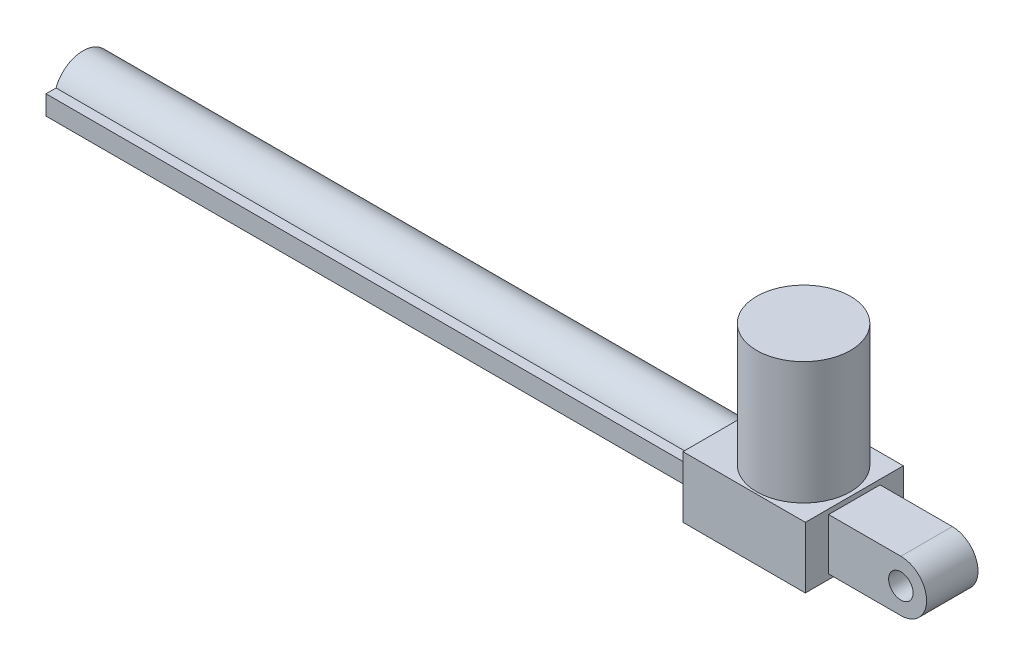
ISO-10303-21;
HEADER;
FILE_DESCRIPTION(('STEP AP214'),'2;1');
FILE_NAME('part.step','',(''),(''),'','','');
FILE_SCHEMA(('AUTOMOTIVE_DESIGN { 1 0 10303 214 1 1 1 1 }'));
ENDSEC;
DATA;
#1=APPLICATION_CONTEXT('core data for automotive mechanical design processes');
#2=APPLICATION_PROTOCOL_DEFINITION('international standard','automotive_design',2000,#1);
#3=PRODUCT_CONTEXT('',#1,'mechanical');
#4=PRODUCT('Part','Part','',(#3));
#5=PRODUCT_RELATED_PRODUCT_CATEGORY('part','',(#4));
#6=PRODUCT_DEFINITION_FORMATION('','',#4);
#7=PRODUCT_DEFINITION_CONTEXT('part definition',#1,'design');
#8=PRODUCT_DEFINITION('design','',#6,#7);
#9=PRODUCT_DEFINITION_SHAPE('','',#8);
#10=(LENGTH_UNIT() NAMED_UNIT(*) SI_UNIT(.MILLI.,.METRE.));
#11=(NAMED_UNIT(*) PLANE_ANGLE_UNIT() SI_UNIT($,.RADIAN.));
#12=(NAMED_UNIT(*) SI_UNIT($,.STERADIAN.) SOLID_ANGLE_UNIT());
#13=UNCERTAINTY_MEASURE_WITH_UNIT(LENGTH_MEASURE(1.E-05),#10,'distance_accuracy_value','');
#14=(GEOMETRIC_REPRESENTATION_CONTEXT(3) GLOBAL_UNCERTAINTY_ASSIGNED_CONTEXT((#13)) GLOBAL_UNIT_ASSIGNED_CONTEXT((#10,
#11,#12)) REPRESENTATION_CONTEXT('',''));
#15=CARTESIAN_POINT('',(0.,0.,0.));
#16=DIRECTION('',(0.,0.,1.));
#17=DIRECTION('',(1.,0.,0.));
#18=AXIS2_PLACEMENT_3D('',#15,#16,#17);
#19=CARTESIAN_POINT('',(-24.0350877192983,0.,6.81578947368422));
#20=DIRECTION('',(0.,0.,-1.));
#21=DIRECTION('',(0.,1.,0.));
#22=AXIS2_PLACEMENT_3D('',#19,#20,#21);
#23=PLANE('',#22);
#24=DIRECTION('',(-1.,0.,0.));
#25=VECTOR('',#24,1.);
#26=CARTESIAN_POINT('',(-24.0350877192983,2.,6.81578947368422));
#27=LINE('',#26,#25);
#28=CARTESIAN_POINT('',(-34.5350877192983,2.,6.81578947368422));
#29=VERTEX_POINT('',#28);
#30=CARTESIAN_POINT('',(-64.0350877192983,2.,6.81578947368422));
#31=VERTEX_POINT('',#30);
#32=EDGE_CURVE('E235',#29,#31,#27,.T.);
#33=ORIENTED_EDGE('',*,*,#32,.F.);
#34=CARTESIAN_POINT('',(-34.5350877192983,12.5,6.81578947368422));
#35=DIRECTION('',(0.,0.,-1.));
#36=DIRECTION('',(0.,1.,0.));
#37=AXIS2_PLACEMENT_3D('',#34,#35,#36);
#38=CIRCLE('',#37,10.5);
#39=CARTESIAN_POINT('',(-34.5350877192983,23.,6.81578947368422));
#40=VERTEX_POINT('',#39);
#41=EDGE_CURVE('E222',#29,#40,#38,.F.);
#42=ORIENTED_EDGE('',*,*,#41,.T.);
#43=DIRECTION('',(-1.,0.,0.));
#44=VECTOR('',#43,1.);
#45=CARTESIAN_POINT('',(-24.0350877192983,23.,6.81578947368422));
#46=LINE('',#45,#44);
#47=CARTESIAN_POINT('',(-64.0350877192983,23.,6.81578947368422));
#48=VERTEX_POINT('',#47);
#49=EDGE_CURVE('E145',#40,#48,#46,.T.);
#50=ORIENTED_EDGE('',*,*,#49,.T.);
#51=DIRECTION('',(0.,-1.,0.));
#52=VECTOR('',#51,1.);
#53=CARTESIAN_POINT('',(-64.0350877192983,0.,6.81578947368422));
#54=LINE('',#53,#52);
#55=EDGE_CURVE('E229',#48,#31,#54,.T.);
#56=ORIENTED_EDGE('',*,*,#55,.T.);
#57=EDGE_LOOP('',(#33,#42,#50,#56));
#58=FACE_BOUND('',#57,.T.);
#59=CARTESIAN_POINT('',(-34.5350877192983,12.5,6.81578947368422));
#60=DIRECTION('',(0.,0.,-1.));
#61=DIRECTION('',(0.,1.,0.));
#62=AXIS2_PLACEMENT_3D('',#59,#60,#61);
#63=CIRCLE('',#62,5.);
#64=CARTESIAN_POINT('',(-34.5350877192983,17.5,6.81578947368422));
#65=VERTEX_POINT('',#64);
#66=EDGE_CURVE('E238',#65,#65,#63,.F.);
#67=ORIENTED_EDGE('',*,*,#66,.F.);
#68=EDGE_LOOP('',(#67));
#69=FACE_BOUND('',#68,.T.);
#70=ADVANCED_FACE('F128',(#58,#69),#23,.F.);
#71=CARTESIAN_POINT('',(-24.0350877192983,0.,-14.1842105263158));
#72=DIRECTION('',(0.,0.,-1.));
#73=DIRECTION('',(0.,1.,0.));
#74=AXIS2_PLACEMENT_3D('',#71,#72,#73);
#75=PLANE('',#74);
#76=CARTESIAN_POINT('',(-34.5350877192983,12.5,-14.1842105263158));
#77=DIRECTION('',(0.,0.,-1.));
#78=DIRECTION('',(0.,1.,0.));
#79=AXIS2_PLACEMENT_3D('',#76,#77,#78);
#80=CIRCLE('',#79,5.);
#81=CARTESIAN_POINT('',(-34.5350877192983,17.5,-14.1842105263158));
#82=VERTEX_POINT('',#81);
#83=EDGE_CURVE('E132',#82,#82,#80,.F.);
#84=ORIENTED_EDGE('',*,*,#83,.T.);
#85=EDGE_LOOP('',(#84));
#86=FACE_BOUND('',#85,.T.);
#87=CARTESIAN_POINT('',(-34.5350877192983,12.5,-14.1842105263158));
#88=DIRECTION('',(0.,0.,-1.));
#89=DIRECTION('',(0.,1.,0.));
#90=AXIS2_PLACEMENT_3D('',#87,#88,#89);
#91=CIRCLE('',#90,10.5);
#92=CARTESIAN_POINT('',(-34.5350877192983,2.,-14.1842105263158));
#93=VERTEX_POINT('',#92);
#94=CARTESIAN_POINT('',(-34.5350877192983,23.,-14.1842105263158));
#95=VERTEX_POINT('',#94);
#96=EDGE_CURVE('E230',#93,#95,#91,.F.);
#97=ORIENTED_EDGE('',*,*,#96,.F.);
#98=DIRECTION('',(-1.,0.,0.));
#99=VECTOR('',#98,1.);
#100=CARTESIAN_POINT('',(-24.0350877192983,2.,-14.1842105263158));
#101=LINE('',#100,#99);
#102=CARTESIAN_POINT('',(-64.0350877192983,2.,-14.1842105263158));
#103=VERTEX_POINT('',#102);
#104=EDGE_CURVE('E237',#93,#103,#101,.T.);
#105=ORIENTED_EDGE('',*,*,#104,.T.);
#106=DIRECTION('',(0.,-1.,0.));
#107=VECTOR('',#106,1.);
#108=CARTESIAN_POINT('',(-64.0350877192983,0.,-14.1842105263158));
#109=LINE('',#108,#107);
#110=CARTESIAN_POINT('',(-64.0350877192983,23.,-14.1842105263158));
#111=VERTEX_POINT('',#110);
#112=EDGE_CURVE('E527',#111,#103,#109,.T.);
#113=ORIENTED_EDGE('',*,*,#112,.F.);
#114=DIRECTION('',(-1.,0.,0.));
#115=VECTOR('',#114,1.);
#116=CARTESIAN_POINT('',(-24.0350877192983,23.,-14.1842105263158));
#117=LINE('',#116,#115);
#118=EDGE_CURVE('E153',#95,#111,#117,.T.);
#119=ORIENTED_EDGE('',*,*,#118,.F.);
#120=EDGE_LOOP('',(#97,#105,#113,#119));
#121=FACE_BOUND('',#120,.T.);
#122=ADVANCED_FACE('F351',(#86,#121),#75,.T.);
#123=CARTESIAN_POINT('',(-64.0350877192983,25.,-23.6842105263158));
#124=DIRECTION('',(-1.,0.,0.));
#125=DIRECTION('',(0.,0.,1.));
#126=AXIS2_PLACEMENT_3D('',#123,#124,#125);
#127=PLANE('',#126);
#128=DIRECTION('',(0.,0.,-1.));
#129=VECTOR('',#128,1.);
#130=CARTESIAN_POINT('',(-64.0350877192983,0.,-23.6842105263158));
#131=LINE('',#130,#129);
#132=CARTESIAN_POINT('',(-64.0350877192983,0.,16.3157894736842));
#133=VERTEX_POINT('',#132);
#134=CARTESIAN_POINT('',(-64.0350877192983,0.,-23.6842105263158));
#135=VERTEX_POINT('',#134);
#136=EDGE_CURVE('E302',#133,#135,#131,.T.);
#137=ORIENTED_EDGE('',*,*,#136,.T.);
#138=DIRECTION('',(0.,-1.,0.));
#139=VECTOR('',#138,1.);
#140=CARTESIAN_POINT('',(-64.0350877192983,25.,-23.6842105263158));
#141=LINE('',#140,#139);
#142=CARTESIAN_POINT('',(-64.0350877192983,25.,-23.6842105263158));
#143=VERTEX_POINT('',#142);
#144=EDGE_CURVE('E307',#143,#135,#141,.T.);
#145=ORIENTED_EDGE('',*,*,#144,.F.);
#146=DIRECTION('',(0.,0.,-1.));
#147=VECTOR('',#146,1.);
#148=CARTESIAN_POINT('',(-64.0350877192983,25.,-23.6842105263158));
#149=LINE('',#148,#147);
#150=CARTESIAN_POINT('',(-64.0350877192983,25.,16.3157894736842));
#151=VERTEX_POINT('',#150);
#152=EDGE_CURVE('E293',#151,#143,#149,.T.);
#153=ORIENTED_EDGE('',*,*,#152,.F.);
#154=DIRECTION('',(0.,-1.,0.));
#155=VECTOR('',#154,1.);
#156=CARTESIAN_POINT('',(-64.0350877192983,25.,16.3157894736842));
#157=LINE('',#156,#155);
#158=EDGE_CURVE('E310',#151,#133,#157,.T.);
#159=ORIENTED_EDGE('',*,*,#158,.T.);
#160=EDGE_LOOP('',(#137,#145,#153,#159));
#161=FACE_BOUND('',#160,.T.);
#162=ORIENTED_EDGE('',*,*,#55,.F.);
#163=DIRECTION('',(0.,0.,-1.));
#164=VECTOR('',#163,1.);
#165=CARTESIAN_POINT('',(-64.0350877192983,23.,0.));
#166=LINE('',#165,#164);
#167=EDGE_CURVE('E530',#48,#111,#166,.T.);
#168=ORIENTED_EDGE('',*,*,#167,.T.);
#169=ORIENTED_EDGE('',*,*,#112,.T.);
#170=DIRECTION('',(0.,0.,-1.));
#171=VECTOR('',#170,1.);
#172=CARTESIAN_POINT('',(-64.0350877192983,2.,0.));
#173=LINE('',#172,#171);
#174=EDGE_CURVE('E525',#31,#103,#173,.T.);
#175=ORIENTED_EDGE('',*,*,#174,.F.);
#176=EDGE_LOOP('',(#162,#168,#169,#175));
#177=FACE_BOUND('',#176,.T.);
#178=ADVANCED_FACE('F329',(#161,#177),#127,.F.);
#179=CARTESIAN_POINT('',(-114.035087719298,25.,-23.6842105263158));
#180=DIRECTION('',(1.,0.,0.));
#181=DIRECTION('',(0.,0.,-1.));
#182=AXIS2_PLACEMENT_3D('',#179,#180,#181);
#183=PLANE('',#182);
#184=DIRECTION('',(0.,0.,1.));
#185=VECTOR('',#184,1.);
#186=CARTESIAN_POINT('',(-114.035087719298,0.,-23.6842105263158));
#187=LINE('',#186,#185);
#188=CARTESIAN_POINT('',(-114.035087719298,0.,-23.6842105263158));
#189=VERTEX_POINT('',#188);
#190=CARTESIAN_POINT('',(-114.035087719298,0.,16.3157894736842));
#191=VERTEX_POINT('',#190);
#192=EDGE_CURVE('E285',#189,#191,#187,.T.);
#193=ORIENTED_EDGE('',*,*,#192,.T.);
#194=DIRECTION('',(0.,-1.,0.));
#195=VECTOR('',#194,1.);
#196=CARTESIAN_POINT('',(-114.035087719298,25.,16.3157894736842));
#197=LINE('',#196,#195);
#198=CARTESIAN_POINT('',(-114.035087719298,25.,16.3157894736842));
#199=VERTEX_POINT('',#198);
#200=EDGE_CURVE('E137',#199,#191,#197,.T.);
#201=ORIENTED_EDGE('',*,*,#200,.F.);
#202=DIRECTION('',(0.,0.,1.));
#203=VECTOR('',#202,1.);
#204=CARTESIAN_POINT('',(-114.035087719298,25.,-23.6842105263158));
#205=LINE('',#204,#203);
#206=CARTESIAN_POINT('',(-114.035087719298,25.,-23.6842105263158));
#207=VERTEX_POINT('',#206);
#208=EDGE_CURVE('E287',#207,#199,#205,.T.);
#209=ORIENTED_EDGE('',*,*,#208,.F.);
#210=DIRECTION('',(0.,-1.,0.));
#211=VECTOR('',#210,1.);
#212=CARTESIAN_POINT('',(-114.035087719298,25.,-23.6842105263158));
#213=LINE('',#212,#211);
#214=EDGE_CURVE('E297',#207,#189,#213,.T.);
#215=ORIENTED_EDGE('',*,*,#214,.T.);
#216=EDGE_LOOP('',(#193,#201,#209,#215));
#217=FACE_BOUND('',#216,.T.);
#218=CARTESIAN_POINT('',(-114.035087719298,12.5,-3.68421052631578));
#219=DIRECTION('',(-1.,0.,0.));
#220=DIRECTION('',(0.,0.,1.));
#221=AXIS2_PLACEMENT_3D('',#218,#219,#220);
#222=CIRCLE('',#221,11.7863583196308);
#223=CARTESIAN_POINT('',(-114.035087719298,16.643229465341,7.34991345505487));
#224=VERTEX_POINT('',#223);
#225=CARTESIAN_POINT('',(-114.035087719298,8.73562524043602,7.48484158692493));
#226=VERTEX_POINT('',#225);
#227=EDGE_CURVE('E244',#224,#226,#222,.T.);
#228=ORIENTED_EDGE('',*,*,#227,.F.);
#229=DIRECTION('',(0.,0.,1.));
#230=VECTOR('',#229,1.);
#231=CARTESIAN_POINT('',(-114.035087719298,16.643229465341,0.));
#232=LINE('',#231,#230);
#233=CARTESIAN_POINT('',(-114.035087719298,16.643229465341,11.4452547961822));
#234=VERTEX_POINT('',#233);
#235=EDGE_CURVE('E253',#224,#234,#232,.T.);
#236=ORIENTED_EDGE('',*,*,#235,.T.);
#237=DIRECTION('',(0.,-1.,0.));
#238=VECTOR('',#237,1.);
#239=CARTESIAN_POINT('',(-114.035087719298,0.,11.4452547961821));
#240=LINE('',#239,#238);
#241=CARTESIAN_POINT('',(-114.035087719298,8.73562524043602,11.4452547961821));
#242=VERTEX_POINT('',#241);
#243=EDGE_CURVE('E270',#234,#242,#240,.T.);
#244=ORIENTED_EDGE('',*,*,#243,.T.);
#245=DIRECTION('',(0.,0.,1.));
#246=VECTOR('',#245,1.);
#247=CARTESIAN_POINT('',(-114.035087719298,8.73562524043602,0.));
#248=LINE('',#247,#246);
#249=EDGE_CURVE('E267',#226,#242,#248,.T.);
#250=ORIENTED_EDGE('',*,*,#249,.F.);
#251=EDGE_LOOP('',(#228,#236,#244,#250));
#252=FACE_BOUND('',#251,.T.);
#253=ADVANCED_FACE('F320',(#217,#252),#183,.F.);
#254=CARTESIAN_POINT('',(-114.035087719298,25.,16.3157894736842));
#255=DIRECTION('',(0.,0.,-1.));
#256=DIRECTION('',(-1.,0.,0.));
#257=AXIS2_PLACEMENT_3D('',#254,#255,#256);
#258=PLANE('',#257);
#259=DIRECTION('',(1.,0.,0.));
#260=VECTOR('',#259,1.);
#261=CARTESIAN_POINT('',(-114.035087719298,0.,16.3157894736842));
#262=LINE('',#261,#260);
#263=EDGE_CURVE('E300',#191,#133,#262,.T.);
#264=ORIENTED_EDGE('',*,*,#263,.T.);
#265=ORIENTED_EDGE('',*,*,#158,.F.);
#266=DIRECTION('',(1.,0.,0.));
#267=VECTOR('',#266,1.);
#268=CARTESIAN_POINT('',(-114.035087719298,25.,16.3157894736842));
#269=LINE('',#268,#267);
#270=EDGE_CURVE('E290',#199,#151,#269,.T.);
#271=ORIENTED_EDGE('',*,*,#270,.F.);
#272=ORIENTED_EDGE('',*,*,#200,.T.);
#273=EDGE_LOOP('',(#264,#265,#271,#272));
#274=FACE_BOUND('',#273,.T.);
#275=ADVANCED_FACE('F315',(#274),#258,.F.);
#276=CARTESIAN_POINT('',(-114.035087719298,25.,-23.6842105263158));
#277=DIRECTION('',(0.,0.,1.));
#278=DIRECTION('',(1.,0.,0.));
#279=AXIS2_PLACEMENT_3D('',#276,#277,#278);
#280=PLANE('',#279);
#281=DIRECTION('',(-1.,0.,0.));
#282=VECTOR('',#281,1.);
#283=CARTESIAN_POINT('',(-114.035087719298,0.,-23.6842105263158));
#284=LINE('',#283,#282);
#285=EDGE_CURVE('E291',#135,#189,#284,.T.);
#286=ORIENTED_EDGE('',*,*,#285,.T.);
#287=ORIENTED_EDGE('',*,*,#214,.F.);
#288=DIRECTION('',(-1.,0.,0.));
#289=VECTOR('',#288,1.);
#290=CARTESIAN_POINT('',(-114.035087719298,25.,-23.6842105263158));
#291=LINE('',#290,#289);
#292=EDGE_CURVE('E295',#143,#207,#291,.T.);
#293=ORIENTED_EDGE('',*,*,#292,.F.);
#294=ORIENTED_EDGE('',*,*,#144,.T.);
#295=EDGE_LOOP('',(#286,#287,#293,#294));
#296=FACE_BOUND('',#295,.T.);
#297=ADVANCED_FACE('F334',(#296),#280,.F.);
#298=CARTESIAN_POINT('',(0.,25.,0.));
#299=DIRECTION('',(0.,1.,0.));
#300=DIRECTION('',(0.,0.,1.));
#301=AXIS2_PLACEMENT_3D('',#298,#299,#300);
#302=PLANE('',#301);
#303=CARTESIAN_POINT('',(-84.7705318729496,25.,-3.68421052631579));
#304=DIRECTION('',(0.,1.,0.));
#305=DIRECTION('',(0.,0.,1.));
#306=AXIS2_PLACEMENT_3D('',#303,#304,#305);
#307=CIRCLE('',#306,19.1585508477146);
#308=CARTESIAN_POINT('',(-84.7705318729496,25.,15.4743403213988));
#309=VERTEX_POINT('',#308);
#310=EDGE_CURVE('E12',#309,#309,#307,.T.);
#311=ORIENTED_EDGE('',*,*,#310,.F.);
#312=EDGE_LOOP('',(#311));
#313=FACE_BOUND('',#312,.T.);
#314=ORIENTED_EDGE('',*,*,#208,.T.);
#315=ORIENTED_EDGE('',*,*,#270,.T.);
#316=ORIENTED_EDGE('',*,*,#152,.T.);
#317=ORIENTED_EDGE('',*,*,#292,.T.);
#318=EDGE_LOOP('',(#314,#315,#316,#317));
#319=FACE_BOUND('',#318,.T.);
#320=ADVANCED_FACE('F336',(#313,#319),#302,.T.);
#321=CARTESIAN_POINT('',(0.,0.,0.));
#322=DIRECTION('',(0.,1.,0.));
#323=DIRECTION('',(0.,0.,1.));
#324=AXIS2_PLACEMENT_3D('',#321,#322,#323);
#325=PLANE('',#324);
#326=ORIENTED_EDGE('',*,*,#192,.F.);
#327=ORIENTED_EDGE('',*,*,#285,.F.);
#328=ORIENTED_EDGE('',*,*,#136,.F.);
#329=ORIENTED_EDGE('',*,*,#263,.F.);
#330=EDGE_LOOP('',(#326,#327,#328,#329));
#331=FACE_BOUND('',#330,.T.);
#332=ADVANCED_FACE('F325',(#331),#325,.F.);
#333=CARTESIAN_POINT('',(-84.7705318729496,75.,-3.68421052631579));
#334=DIRECTION('',(0.,-1.,0.));
#335=DIRECTION('',(0.,0.,-1.));
#336=AXIS2_PLACEMENT_3D('',#333,#334,#335);
#337=CYLINDRICAL_SURFACE('',#336,19.1585508477146);
#338=CARTESIAN_POINT('',(-84.7705318729496,75.,-3.68421052631579));
#339=DIRECTION('',(0.,1.,0.));
#340=DIRECTION('',(0.,0.,1.));
#341=AXIS2_PLACEMENT_3D('',#338,#339,#340);
#342=CIRCLE('',#341,19.1585508477146);
#343=CARTESIAN_POINT('',(-84.7705318729496,75.,15.4743403213988));
#344=VERTEX_POINT('',#343);
#345=EDGE_CURVE('E283',#344,#344,#342,.T.);
#346=ORIENTED_EDGE('',*,*,#345,.F.);
#347=EDGE_LOOP('',(#346));
#348=FACE_BOUND('',#347,.T.);
#349=ORIENTED_EDGE('',*,*,#310,.T.);
#350=EDGE_LOOP('',(#349));
#351=FACE_BOUND('',#350,.T.);
#352=ADVANCED_FACE('F344',(#348,#351),#337,.T.);
#353=CARTESIAN_POINT('',(0.,75.,0.));
#354=DIRECTION('',(0.,1.,0.));
#355=DIRECTION('',(0.,0.,1.));
#356=AXIS2_PLACEMENT_3D('',#353,#354,#355);
#357=PLANE('',#356);
#358=ORIENTED_EDGE('',*,*,#345,.T.);
#359=EDGE_LOOP('',(#358));
#360=FACE_BOUND('',#359,.T.);
#361=ADVANCED_FACE('F381',(#360),#357,.T.);
#362=CARTESIAN_POINT('',(-379.035087719298,12.5,-3.68421052631569));
#363=DIRECTION('',(1.,0.,0.));
#364=DIRECTION('',(0.,0.,-1.));
#365=AXIS2_PLACEMENT_3D('',#362,#363,#364);
#366=CYLINDRICAL_SURFACE('',#365,11.7863583196308);
#367=ORIENTED_EDGE('',*,*,#227,.T.);
#368=DIRECTION('',(1.,0.,0.));
#369=VECTOR('',#368,1.);
#370=CARTESIAN_POINT('',(-379.035087719298,8.73562524043602,7.48484158692502));
#371=LINE('',#370,#369);
#372=CARTESIAN_POINT('',(-379.035087719298,8.73562524043602,7.48484158692502));
#373=VERTEX_POINT('',#372);
#374=EDGE_CURVE('E281',#373,#226,#371,.T.);
#375=ORIENTED_EDGE('',*,*,#374,.F.);
#376=CARTESIAN_POINT('',(-379.035087719298,12.5,-3.68421052631569));
#377=DIRECTION('',(-1.,0.,0.));
#378=DIRECTION('',(0.,0.,1.));
#379=AXIS2_PLACEMENT_3D('',#376,#377,#378);
#380=CIRCLE('',#379,11.7863583196308);
#381=CARTESIAN_POINT('',(-379.035087719298,16.643229465341,7.34991345505496));
#382=VERTEX_POINT('',#381);
#383=EDGE_CURVE('E252',#382,#373,#380,.T.);
#384=ORIENTED_EDGE('',*,*,#383,.F.);
#385=DIRECTION('',(1.,0.,0.));
#386=VECTOR('',#385,1.);
#387=CARTESIAN_POINT('',(-379.035087719298,16.643229465341,7.34991345505496));
#388=LINE('',#387,#386);
#389=EDGE_CURVE('E263',#382,#224,#388,.T.);
#390=ORIENTED_EDGE('',*,*,#389,.T.);
#391=EDGE_LOOP('',(#367,#375,#384,#390));
#392=FACE_BOUND('',#391,.T.);
#393=ADVANCED_FACE('F377',(#392),#366,.T.);
#394=CARTESIAN_POINT('',(-379.035087719298,8.73562524043602,1.34908356391357E-13));
#395=DIRECTION('',(0.,1.,0.));
#396=DIRECTION('',(0.,0.,1.));
#397=AXIS2_PLACEMENT_3D('',#394,#395,#396);
#398=PLANE('',#397);
#399=ORIENTED_EDGE('',*,*,#249,.T.);
#400=DIRECTION('',(1.,0.,0.));
#401=VECTOR('',#400,1.);
#402=CARTESIAN_POINT('',(-379.035087719298,8.73562524043602,11.4452547961822));
#403=LINE('',#402,#401);
#404=CARTESIAN_POINT('',(-379.035087719298,8.73562524043602,11.4452547961822));
#405=VERTEX_POINT('',#404);
#406=EDGE_CURVE('E279',#405,#242,#403,.T.);
#407=ORIENTED_EDGE('',*,*,#406,.F.);
#408=DIRECTION('',(0.,0.,1.));
#409=VECTOR('',#408,1.);
#410=CARTESIAN_POINT('',(-379.035087719298,8.73562524043602,1.34908356391357E-13));
#411=LINE('',#410,#409);
#412=EDGE_CURVE('E256',#373,#405,#411,.T.);
#413=ORIENTED_EDGE('',*,*,#412,.F.);
#414=ORIENTED_EDGE('',*,*,#374,.T.);
#415=EDGE_LOOP('',(#399,#407,#413,#414));
#416=FACE_BOUND('',#415,.T.);
#417=ADVANCED_FACE('F373',(#416),#398,.F.);
#418=CARTESIAN_POINT('',(-379.035087719298,0.,11.4452547961822));
#419=DIRECTION('',(0.,0.,1.));
#420=DIRECTION('',(1.,0.,0.));
#421=AXIS2_PLACEMENT_3D('',#418,#419,#420);
#422=PLANE('',#421);
#423=ORIENTED_EDGE('',*,*,#243,.F.);
#424=DIRECTION('',(1.,0.,0.));
#425=VECTOR('',#424,1.);
#426=CARTESIAN_POINT('',(-379.035087719298,16.643229465341,11.4452547961822));
#427=LINE('',#426,#425);
#428=CARTESIAN_POINT('',(-379.035087719298,16.643229465341,11.4452547961822));
#429=VERTEX_POINT('',#428);
#430=EDGE_CURVE('E276',#429,#234,#427,.T.);
#431=ORIENTED_EDGE('',*,*,#430,.F.);
#432=DIRECTION('',(0.,-1.,0.));
#433=VECTOR('',#432,1.);
#434=CARTESIAN_POINT('',(-379.035087719298,0.,11.4452547961822));
#435=LINE('',#434,#433);
#436=EDGE_CURVE('E258',#429,#405,#435,.T.);
#437=ORIENTED_EDGE('',*,*,#436,.T.);
#438=ORIENTED_EDGE('',*,*,#406,.T.);
#439=EDGE_LOOP('',(#423,#431,#437,#438));
#440=FACE_BOUND('',#439,.T.);
#441=ADVANCED_FACE('F370',(#440),#422,.T.);
#442=CARTESIAN_POINT('',(-379.035087719298,12.5,-3.68421052631569));
#443=DIRECTION('',(1.,0.,0.));
#444=DIRECTION('',(0.,0.,-1.));
#445=AXIS2_PLACEMENT_3D('',#442,#443,#444);
#446=CYLINDRICAL_SURFACE('',#445,9.51427354791665);
#447=CARTESIAN_POINT('',(-379.035087719298,12.5,-3.68421052631569));
#448=DIRECTION('',(-1.,0.,0.));
#449=DIRECTION('',(0.,0.,1.));
#450=AXIS2_PLACEMENT_3D('',#447,#448,#449);
#451=CIRCLE('',#450,9.51427354791665);
#452=CARTESIAN_POINT('',(-379.035087719298,12.5,5.83006302160096));
#453=VERTEX_POINT('',#452);
#454=EDGE_CURVE('E249',#453,#453,#451,.T.);
#455=ORIENTED_EDGE('',*,*,#454,.T.);
#456=EDGE_LOOP('',(#455));
#457=FACE_BOUND('',#456,.T.);
#458=CARTESIAN_POINT('',(-114.035087719298,12.5,-3.68421052631578));
#459=DIRECTION('',(-1.,0.,0.));
#460=DIRECTION('',(0.,0.,1.));
#461=AXIS2_PLACEMENT_3D('',#458,#459,#460);
#462=CIRCLE('',#461,9.51427354791665);
#463=CARTESIAN_POINT('',(-114.035087719298,12.5,5.83006302160086));
#464=VERTEX_POINT('',#463);
#465=EDGE_CURVE('E241',#464,#464,#462,.T.);
#466=ORIENTED_EDGE('',*,*,#465,.F.);
#467=EDGE_LOOP('',(#466));
#468=FACE_BOUND('',#467,.T.);
#469=ADVANCED_FACE('F368',(#457,#468),#446,.F.);
#470=CARTESIAN_POINT('',(-379.035087719298,16.643229465341,1.34908356391357E-13));
#471=DIRECTION('',(0.,1.,0.));
#472=DIRECTION('',(0.,0.,1.));
#473=AXIS2_PLACEMENT_3D('',#470,#471,#472);
#474=PLANE('',#473);
#475=ORIENTED_EDGE('',*,*,#235,.F.);
#476=ORIENTED_EDGE('',*,*,#389,.F.);
#477=DIRECTION('',(0.,0.,1.));
#478=VECTOR('',#477,1.);
#479=CARTESIAN_POINT('',(-379.035087719298,16.643229465341,1.34908356391357E-13));
#480=LINE('',#479,#478);
#481=EDGE_CURVE('E261',#382,#429,#480,.T.);
#482=ORIENTED_EDGE('',*,*,#481,.T.);
#483=ORIENTED_EDGE('',*,*,#430,.T.);
#484=EDGE_LOOP('',(#475,#476,#482,#483));
#485=FACE_BOUND('',#484,.T.);
#486=ADVANCED_FACE('F364',(#485),#474,.T.);
#487=CARTESIAN_POINT('',(-379.035087719298,0.,1.34908356391357E-13));
#488=DIRECTION('',(-1.,0.,0.));
#489=DIRECTION('',(0.,0.,1.));
#490=AXIS2_PLACEMENT_3D('',#487,#488,#489);
#491=PLANE('',#490);
#492=ORIENTED_EDGE('',*,*,#454,.F.);
#493=EDGE_LOOP('',(#492));
#494=FACE_BOUND('',#493,.T.);
#495=ORIENTED_EDGE('',*,*,#383,.T.);
#496=ORIENTED_EDGE('',*,*,#412,.T.);
#497=ORIENTED_EDGE('',*,*,#436,.F.);
#498=ORIENTED_EDGE('',*,*,#481,.F.);
#499=EDGE_LOOP('',(#495,#496,#497,#498));
#500=FACE_BOUND('',#499,.T.);
#501=ADVANCED_FACE('F361',(#494,#500),#491,.T.);
#502=ORIENTED_EDGE('',*,*,#465,.T.);
#503=EDGE_LOOP('',(#502));
#504=FACE_BOUND('',#503,.T.);
#505=ADVANCED_FACE('F130',(#504),#183,.F.);
#506=CARTESIAN_POINT('',(-24.0350877192983,2.,0.));
#507=DIRECTION('',(0.,1.,0.));
#508=DIRECTION('',(0.,0.,1.));
#509=AXIS2_PLACEMENT_3D('',#506,#507,#508);
#510=PLANE('',#509);
#511=ORIENTED_EDGE('',*,*,#104,.F.);
#512=DIRECTION('',(0.,0.,1.));
#513=VECTOR('',#512,1.);
#514=CARTESIAN_POINT('',(-34.5350877192983,2.,-18.1842105263158));
#515=LINE('',#514,#513);
#516=EDGE_CURVE('E225',#93,#29,#515,.T.);
#517=ORIENTED_EDGE('',*,*,#516,.T.);
#518=ORIENTED_EDGE('',*,*,#32,.T.);
#519=ORIENTED_EDGE('',*,*,#174,.T.);
#520=EDGE_LOOP('',(#511,#517,#518,#519));
#521=FACE_BOUND('',#520,.T.);
#522=ADVANCED_FACE('F233',(#521),#510,.F.);
#523=CARTESIAN_POINT('',(-24.0350877192983,23.,0.));
#524=DIRECTION('',(0.,1.,0.));
#525=DIRECTION('',(0.,0.,1.));
#526=AXIS2_PLACEMENT_3D('',#523,#524,#525);
#527=PLANE('',#526);
#528=DIRECTION('',(0.,0.,-1.));
#529=VECTOR('',#528,1.);
#530=CARTESIAN_POINT('',(-34.5350877192983,23.,16.3157894736842));
#531=LINE('',#530,#529);
#532=EDGE_CURVE('E227',#40,#95,#531,.T.);
#533=ORIENTED_EDGE('',*,*,#532,.T.);
#534=ORIENTED_EDGE('',*,*,#118,.T.);
#535=ORIENTED_EDGE('',*,*,#167,.F.);
#536=ORIENTED_EDGE('',*,*,#49,.F.);
#537=EDGE_LOOP('',(#533,#534,#535,#536));
#538=FACE_BOUND('',#537,.T.);
#539=ADVANCED_FACE('F461',(#538),#527,.T.);
#540=CARTESIAN_POINT('',(-34.5350877192983,12.5,16.3157894736842));
#541=DIRECTION('',(0.,0.,-1.));
#542=DIRECTION('',(-1.,0.,0.));
#543=AXIS2_PLACEMENT_3D('',#540,#541,#542);
#544=CYLINDRICAL_SURFACE('',#543,10.5);
#545=ORIENTED_EDGE('',*,*,#41,.F.);
#546=ORIENTED_EDGE('',*,*,#516,.F.);
#547=ORIENTED_EDGE('',*,*,#96,.T.);
#548=ORIENTED_EDGE('',*,*,#532,.F.);
#549=EDGE_LOOP('',(#545,#546,#547,#548));
#550=FACE_BOUND('',#549,.T.);
#551=ADVANCED_FACE('F224',(#550),#544,.T.);
#552=CARTESIAN_POINT('',(-34.5350877192983,12.5,16.3157894736842));
#553=DIRECTION('',(0.,0.,-1.));
#554=DIRECTION('',(-1.,0.,0.));
#555=AXIS2_PLACEMENT_3D('',#552,#553,#554);
#556=CYLINDRICAL_SURFACE('',#555,5.);
#557=ORIENTED_EDGE('',*,*,#83,.F.);
#558=EDGE_LOOP('',(#557));
#559=FACE_BOUND('',#558,.T.);
#560=ORIENTED_EDGE('',*,*,#66,.T.);
#561=EDGE_LOOP('',(#560));
#562=FACE_BOUND('',#561,.T.);
#563=ADVANCED_FACE('F485',(#559,#562),#556,.F.);
#564=CLOSED_SHELL('',(#70,#122,#178,#253,#275,#297,#320,#332,#352,#361,#393,#417,#441,#469,#486,
#501,#505,#522,#539,#551,#563));
#565=MANIFOLD_SOLID_BREP('B2',#564);
#566=ADVANCED_BREP_SHAPE_REPRESENTATION('',(#18,#565),#14);
#567=SHAPE_DEFINITION_REPRESENTATION(#9,#566);
ENDSEC;
END-ISO-10303-21;
